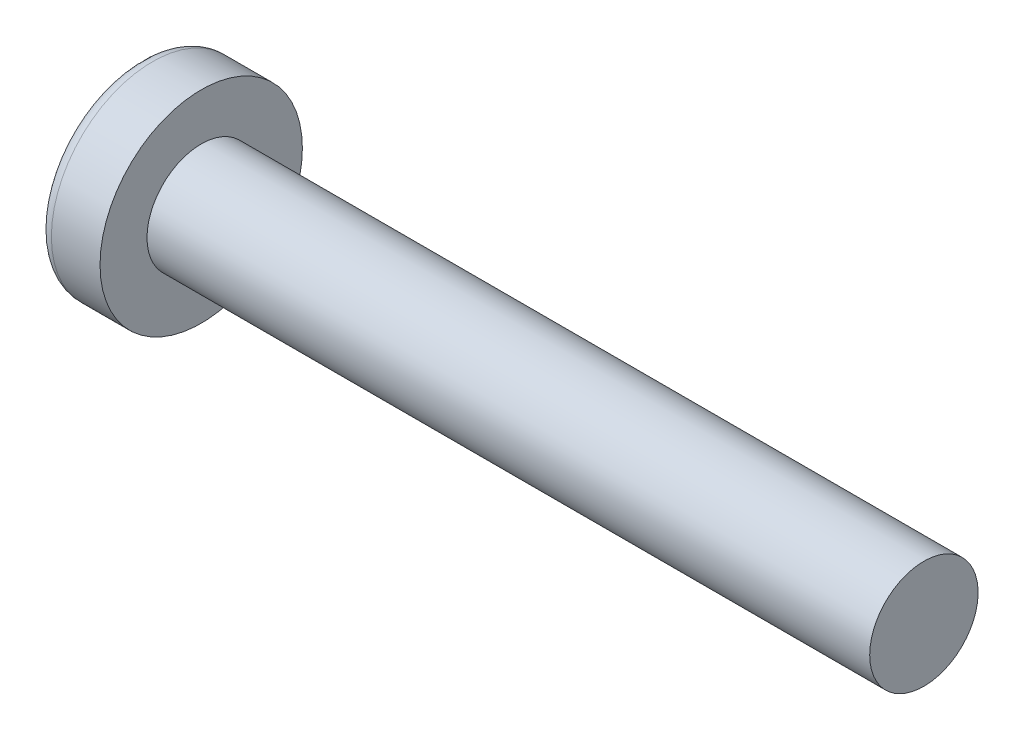
ISO-10303-21;
HEADER;
FILE_DESCRIPTION(('STEP AP214'),'2;1');
FILE_NAME('part.step','',(''),(''),'','','');
FILE_SCHEMA(('AUTOMOTIVE_DESIGN { 1 0 10303 214 1 1 1 1 }'));
ENDSEC;
DATA;
#1=APPLICATION_CONTEXT('core data for automotive mechanical design processes');
#2=APPLICATION_PROTOCOL_DEFINITION('international standard','automotive_design',2000,#1);
#3=PRODUCT_CONTEXT('',#1,'mechanical');
#4=PRODUCT('Part','Part','',(#3));
#5=PRODUCT_RELATED_PRODUCT_CATEGORY('part','',(#4));
#6=PRODUCT_DEFINITION_FORMATION('','',#4);
#7=PRODUCT_DEFINITION_CONTEXT('part definition',#1,'design');
#8=PRODUCT_DEFINITION('design','',#6,#7);
#9=PRODUCT_DEFINITION_SHAPE('','',#8);
#10=(LENGTH_UNIT() NAMED_UNIT(*) SI_UNIT(.MILLI.,.METRE.));
#11=(NAMED_UNIT(*) PLANE_ANGLE_UNIT() SI_UNIT($,.RADIAN.));
#12=(NAMED_UNIT(*) SI_UNIT($,.STERADIAN.) SOLID_ANGLE_UNIT());
#13=UNCERTAINTY_MEASURE_WITH_UNIT(LENGTH_MEASURE(1.E-05),#10,'distance_accuracy_value','');
#14=(GEOMETRIC_REPRESENTATION_CONTEXT(3) GLOBAL_UNCERTAINTY_ASSIGNED_CONTEXT((#13)) GLOBAL_UNIT_ASSIGNED_CONTEXT((#10,
#11,#12)) REPRESENTATION_CONTEXT('',''));
#15=CARTESIAN_POINT('',(0.,0.,0.));
#16=DIRECTION('',(0.,0.,1.));
#17=DIRECTION('',(1.,0.,0.));
#18=AXIS2_PLACEMENT_3D('',#15,#16,#17);
#19=CARTESIAN_POINT('',(2.01739130434783,0.,-0.15794466403162));
#20=DIRECTION('',(-0.104537710696287,0.,0.994520923380891));
#21=DIRECTION('',(0.994520923380891,0.,0.104537710696287));
#22=AXIS2_PLACEMENT_3D('',#19,#20,#21);
#23=PLANE('',#22);
#24=DIRECTION('',(-0.989130931836555,0.103971149085093,-0.103971149085093));
#25=VECTOR('',#24,1.);
#26=CARTESIAN_POINT('',(1.76,0.185000000000001,-0.184999999999999));
#27=LINE('',#26,#25);
#28=CARTESIAN_POINT('',(1.76,0.185,-0.184999999999999));
#29=VERTEX_POINT('',#28);
#30=CARTESIAN_POINT('',(0.0270341343313636,0.367158343834498,-0.367158343834493));
#31=VERTEX_POINT('',#30);
#32=EDGE_CURVE('E178',#29,#31,#27,.T.);
#33=ORIENTED_EDGE('',*,*,#32,.F.);
#34=DIRECTION('',(-0.80907355338853,0.581521616498006,-0.0850446632823175));
#35=VECTOR('',#34,1.);
#36=CARTESIAN_POINT('',(1.76,0.185,-0.185));
#37=LINE('',#36,#35);
#38=CARTESIAN_POINT('',(0.188596138461546,1.31444652548076,-0.350175974082167));
#39=VERTEX_POINT('',#38);
#40=EDGE_CURVE('E186',#29,#39,#37,.T.);
#41=ORIENTED_EDGE('',*,*,#40,.T.);
#42=CARTESIAN_POINT('',(0.188596138461547,1.31444652548076,-0.350175974082167));
#43=CARTESIAN_POINT('',(0.146535741725265,1.15917471210783,-0.354597095330013));
#44=CARTESIAN_POINT('',(0.112042043012942,1.00259812361751,-0.358222853433297));
#45=CARTESIAN_POINT('',(0.0581880416362142,0.686835396402088,-0.363883643350741));
#46=CARTESIAN_POINT('',(0.0388277389718098,0.527649257676991,-0.3659186751649));
#47=CARTESIAN_POINT('',(0.0270341343313647,0.367158343834508,-0.367158343834498));
#48=B_SPLINE_CURVE_WITH_KNOTS('',3,(#42,#43,#44,#45,#46,#47),.UNSPECIFIED.,.F.,.F.,(4,2,4),(0.,
0.481116103371659,0.962232206743319),.UNSPECIFIED.);
#49=EDGE_CURVE('E21',#39,#31,#48,.T.);
#50=ORIENTED_EDGE('',*,*,#49,.T.);
#51=EDGE_LOOP('',(#33,#41,#50));
#52=FACE_BOUND('',#51,.T.);
#53=ADVANCED_FACE('F17',(#52),#23,.T.);
#54=CARTESIAN_POINT('',(1.76,0.185,0.185));
#55=DIRECTION('',(0.583636048152575,0.812015371342714,0.));
#56=DIRECTION('',(-0.812015371342714,0.583636048152575,0.));
#57=AXIS2_PLACEMENT_3D('',#54,#55,#56);
#58=PLANE('',#57);
#59=DIRECTION('',(0.,0.,1.));
#60=VECTOR('',#59,1.);
#61=CARTESIAN_POINT('',(1.76,0.185,0.185));
#62=LINE('',#61,#60);
#63=CARTESIAN_POINT('',(1.76,0.185,0.185));
#64=VERTEX_POINT('',#63);
#65=EDGE_CURVE('E86',#64,#29,#62,.F.);
#66=ORIENTED_EDGE('',*,*,#65,.F.);
#67=DIRECTION('',(0.80907355338853,-0.581521616498006,-0.0850446632823172));
#68=VECTOR('',#67,1.);
#69=CARTESIAN_POINT('',(0.188596138461545,1.31444652548076,0.350175974082167));
#70=LINE('',#69,#68);
#71=CARTESIAN_POINT('',(0.188596138461546,1.31444652548076,0.350175974082167));
#72=VERTEX_POINT('',#71);
#73=EDGE_CURVE('E174',#72,#64,#70,.T.);
#74=ORIENTED_EDGE('',*,*,#73,.F.);
#75=CARTESIAN_POINT('',(0.188596138461547,1.31444652548076,-0.350175974082167));
#76=CARTESIAN_POINT('',(0.181505092768451,1.31954321457259,-0.233450649388112));
#77=CARTESIAN_POINT('',(0.177959569921918,1.32209155911854,-0.116725324694057));
#78=CARTESIAN_POINT('',(0.177959569921975,1.32209155911866,0.116725324694055));
#79=CARTESIAN_POINT('',(0.181505092768566,1.31954321457284,0.233450649388112));
#80=CARTESIAN_POINT('',(0.188596138461719,1.31444652548113,0.350175974082168));
#81=B_SPLINE_CURVE_WITH_KNOTS('',3,(#75,#76,#77,#78,#79,#80),.UNSPECIFIED.,.F.,.F.,(4,2,4),(0.,
0.35042088401523,0.70084176803046),.UNSPECIFIED.);
#82=EDGE_CURVE('E79',#39,#72,#81,.T.);
#83=ORIENTED_EDGE('',*,*,#82,.F.);
#84=ORIENTED_EDGE('',*,*,#40,.F.);
#85=EDGE_LOOP('',(#66,#74,#83,#84));
#86=FACE_BOUND('',#85,.T.);
#87=ADVANCED_FACE('F294',(#86),#58,.F.);
#88=CARTESIAN_POINT('',(2.01739130434783,0.15794466403162,0.));
#89=DIRECTION('',(-0.104537710696287,-0.994520923380891,0.));
#90=DIRECTION('',(0.994520923380891,-0.104537710696287,0.));
#91=AXIS2_PLACEMENT_3D('',#88,#89,#90);
#92=PLANE('',#91);
#93=DIRECTION('',(0.80907355338853,-0.0850446632823192,0.581521616498006));
#94=VECTOR('',#93,1.);
#95=CARTESIAN_POINT('',(0.188596138461544,0.350175974082172,-1.31444652548076));
#96=LINE('',#95,#94);
#97=CARTESIAN_POINT('',(0.188596138461545,0.350175974082172,-1.31444652548076));
#98=VERTEX_POINT('',#97);
#99=EDGE_CURVE('E165',#98,#29,#96,.T.);
#100=ORIENTED_EDGE('',*,*,#99,.T.);
#101=ORIENTED_EDGE('',*,*,#32,.T.);
#102=CARTESIAN_POINT('',(0.0270341343313624,0.367158343834489,-0.367158343834488));
#103=CARTESIAN_POINT('',(0.0388277389718077,0.365918675164897,-0.527649257676975));
#104=CARTESIAN_POINT('',(0.0581880416362123,0.363883643350741,-0.686835396402075));
#105=CARTESIAN_POINT('',(0.11204204301294,0.358222853433303,-1.0025981236175));
#106=CARTESIAN_POINT('',(0.146535741725263,0.354597095330019,-1.15917471210783));
#107=CARTESIAN_POINT('',(0.188596138461545,0.350175974082172,-1.31444652548076));
#108=B_SPLINE_CURVE_WITH_KNOTS('',3,(#102,#103,#104,#105,#106,#107),.UNSPECIFIED.,.F.,.F.,(4,2,
4),(0.,0.481116103371668,0.962232206743337),.UNSPECIFIED.);
#109=EDGE_CURVE('E183',#31,#98,#108,.T.);
#110=ORIENTED_EDGE('',*,*,#109,.T.);
#111=EDGE_LOOP('',(#100,#101,#110));
#112=FACE_BOUND('',#111,.T.);
#113=ADVANCED_FACE('F290',(#112),#92,.T.);
#114=CARTESIAN_POINT('',(2.01739130434783,0.,0.15794466403162));
#115=DIRECTION('',(-0.104537710696287,0.,-0.994520923380891));
#116=DIRECTION('',(-0.994520923380891,0.,0.104537710696287));
#117=AXIS2_PLACEMENT_3D('',#114,#115,#116);
#118=PLANE('',#117);
#119=DIRECTION('',(0.989130931836555,-0.103971149085092,-0.103971149085092));
#120=VECTOR('',#119,1.);
#121=CARTESIAN_POINT('',(0.0270341343313623,0.367158343834486,0.367158343834487));
#122=LINE('',#121,#120);
#123=CARTESIAN_POINT('',(0.0270341343313624,0.367158343834486,0.367158343834487));
#124=VERTEX_POINT('',#123);
#125=EDGE_CURVE('E159',#124,#64,#122,.T.);
#126=ORIENTED_EDGE('',*,*,#125,.F.);
#127=CARTESIAN_POINT('',(0.0270341343313624,0.367158343834486,0.367158343834487));
#128=CARTESIAN_POINT('',(0.0388277389718087,0.527649257676974,0.365918675164895));
#129=CARTESIAN_POINT('',(0.0581880416362138,0.686835396402074,0.363883643350739));
#130=CARTESIAN_POINT('',(0.112042043012942,1.0025981236175,0.358222853433299));
#131=CARTESIAN_POINT('',(0.146535741725265,1.15917471210783,0.354597095330016));
#132=CARTESIAN_POINT('',(0.188596138461547,1.31444652548076,0.350175974082169));
#133=B_SPLINE_CURVE_WITH_KNOTS('',3,(#127,#128,#129,#130,#131,#132),.UNSPECIFIED.,.F.,.F.,(4,2,
4),(0.,0.48111610337167,0.96223220674334),.UNSPECIFIED.);
#134=EDGE_CURVE('E177',#124,#72,#133,.T.);
#135=ORIENTED_EDGE('',*,*,#134,.T.);
#136=ORIENTED_EDGE('',*,*,#73,.T.);
#137=EDGE_LOOP('',(#126,#135,#136));
#138=FACE_BOUND('',#137,.T.);
#139=ADVANCED_FACE('F285',(#138),#118,.T.);
#140=CARTESIAN_POINT('',(1.76,0.185000000000001,-0.184999999999999));
#141=DIRECTION('',(0.583636048152575,0.,-0.812015371342714));
#142=DIRECTION('',(-0.812015371342714,0.,-0.583636048152575));
#143=AXIS2_PLACEMENT_3D('',#140,#141,#142);
#144=PLANE('',#143);
#145=DIRECTION('',(0.,1.,0.));
#146=VECTOR('',#145,1.);
#147=CARTESIAN_POINT('',(1.76,0.185000000000001,-0.184999999999999));
#148=LINE('',#147,#146);
#149=CARTESIAN_POINT('',(1.76,-0.185,-0.185));
#150=VERTEX_POINT('',#149);
#151=EDGE_CURVE('E110',#29,#150,#148,.F.);
#152=ORIENTED_EDGE('',*,*,#151,.F.);
#153=ORIENTED_EDGE('',*,*,#99,.F.);
#154=CARTESIAN_POINT('',(0.188596138461545,-0.350175974082162,-1.31444652548077));
#155=CARTESIAN_POINT('',(0.181505092768444,-0.233450649388107,-1.31954321457268));
#156=CARTESIAN_POINT('',(0.177959569921893,-0.116725324694051,-1.32209155911864));
#157=CARTESIAN_POINT('',(0.177959569921893,0.116725324694061,-1.32209155911864));
#158=CARTESIAN_POINT('',(0.181505092768444,0.233450649388116,-1.31954321457268));
#159=CARTESIAN_POINT('',(0.188596138461545,0.350175974082172,-1.31444652548076));
#160=B_SPLINE_CURVE_WITH_KNOTS('',3,(#154,#155,#156,#157,#158,#159),.UNSPECIFIED.,.F.,.F.,(4,2,
4),(0.,0.350420884015233,0.700841768030466),.UNSPECIFIED.);
#161=CARTESIAN_POINT('',(0.188596138461546,-0.350175974082162,-1.31444652548077));
#162=VERTEX_POINT('',#161);
#163=EDGE_CURVE('E168',#162,#98,#160,.T.);
#164=ORIENTED_EDGE('',*,*,#163,.F.);
#165=DIRECTION('',(-0.80907355338853,-0.0850446632823149,-0.581521616498007));
#166=VECTOR('',#165,1.);
#167=CARTESIAN_POINT('',(1.76,-0.184999999999999,-0.185));
#168=LINE('',#167,#166);
#169=EDGE_CURVE('E153',#150,#162,#168,.T.);
#170=ORIENTED_EDGE('',*,*,#169,.F.);
#171=EDGE_LOOP('',(#152,#153,#164,#170));
#172=FACE_BOUND('',#171,.T.);
#173=ADVANCED_FACE('F282',(#172),#144,.F.);
#174=CARTESIAN_POINT('',(2.01739130434783,0.15794466403162,0.));
#175=DIRECTION('',(-0.104537710696287,-0.994520923380891,0.));
#176=DIRECTION('',(0.994520923380891,-0.104537710696287,0.));
#177=AXIS2_PLACEMENT_3D('',#174,#175,#176);
#178=PLANE('',#177);
#179=ORIENTED_EDGE('',*,*,#125,.T.);
#180=DIRECTION('',(-0.80907355338853,0.0850446632823148,0.581521616498006));
#181=VECTOR('',#180,1.);
#182=CARTESIAN_POINT('',(1.76,0.185,0.185));
#183=LINE('',#182,#181);
#184=CARTESIAN_POINT('',(0.188596138461545,0.350175974082162,1.31444652548076));
#185=VERTEX_POINT('',#184);
#186=EDGE_CURVE('E103',#64,#185,#183,.T.);
#187=ORIENTED_EDGE('',*,*,#186,.T.);
#188=CARTESIAN_POINT('',(0.188596138461545,0.350175974082162,1.31444652548076));
#189=CARTESIAN_POINT('',(0.146535741725263,0.354597095330011,1.15917471210783));
#190=CARTESIAN_POINT('',(0.11204204301294,0.358222853433295,1.0025981236175));
#191=CARTESIAN_POINT('',(0.0581880416362123,0.363883643350737,0.686835396402075));
#192=CARTESIAN_POINT('',(0.0388277389718077,0.365918675164894,0.527649257676974));
#193=CARTESIAN_POINT('',(0.0270341343313625,0.367158343834487,0.367158343834487));
#194=B_SPLINE_CURVE_WITH_KNOTS('',3,(#188,#189,#190,#191,#192,#193),.UNSPECIFIED.,.F.,.F.,(4,2,
4),(0.,0.48111610337167,0.962232206743339),.UNSPECIFIED.);
#195=EDGE_CURVE('E162',#185,#124,#194,.T.);
#196=ORIENTED_EDGE('',*,*,#195,.T.);
#197=EDGE_LOOP('',(#179,#187,#196));
#198=FACE_BOUND('',#197,.T.);
#199=ADVANCED_FACE('F256',(#198),#178,.T.);
#200=CARTESIAN_POINT('',(2.01739130434783,-0.15794466403162,0.));
#201=DIRECTION('',(-0.104537710696287,0.994520923380891,0.));
#202=DIRECTION('',(-0.994520923380891,-0.104537710696287,0.));
#203=AXIS2_PLACEMENT_3D('',#200,#201,#202);
#204=PLANE('',#203);
#205=DIRECTION('',(-0.989130931836555,-0.103971149085092,-0.103971149085092));
#206=VECTOR('',#205,1.);
#207=CARTESIAN_POINT('',(1.76,-0.185,-0.185));
#208=LINE('',#207,#206);
#209=CARTESIAN_POINT('',(0.0270341343313625,-0.367158343834486,-0.367158343834489));
#210=VERTEX_POINT('',#209);
#211=EDGE_CURVE('E144',#150,#210,#208,.T.);
#212=ORIENTED_EDGE('',*,*,#211,.F.);
#213=ORIENTED_EDGE('',*,*,#169,.T.);
#214=CARTESIAN_POINT('',(0.188596138461547,-0.350175974082162,-1.31444652548077));
#215=CARTESIAN_POINT('',(0.146535741725264,-0.354597095330011,-1.15917471210783));
#216=CARTESIAN_POINT('',(0.112042043012941,-0.358222853433295,-1.0025981236175));
#217=CARTESIAN_POINT('',(0.0581880416362128,-0.363883643350736,-0.686835396402077));
#218=CARTESIAN_POINT('',(0.038827738971808,-0.365918675164893,-0.527649257676976));
#219=CARTESIAN_POINT('',(0.0270341343313624,-0.367158343834485,-0.367158343834488));
#220=B_SPLINE_CURVE_WITH_KNOTS('',3,(#214,#215,#216,#217,#218,#219),.UNSPECIFIED.,.F.,.F.,(4,2,
4),(0.,0.481116103371671,0.962232206743341),.UNSPECIFIED.);
#221=EDGE_CURVE('E156',#162,#210,#220,.T.);
#222=ORIENTED_EDGE('',*,*,#221,.T.);
#223=EDGE_LOOP('',(#212,#213,#222));
#224=FACE_BOUND('',#223,.T.);
#225=ADVANCED_FACE('F252',(#224),#204,.T.);
#226=CARTESIAN_POINT('',(1.76,-0.185000000000001,0.184999999999999));
#227=DIRECTION('',(0.583636048152575,0.,0.812015371342714));
#228=DIRECTION('',(0.812015371342714,0.,-0.583636048152575));
#229=AXIS2_PLACEMENT_3D('',#226,#227,#228);
#230=PLANE('',#229);
#231=DIRECTION('',(0.,1.,0.));
#232=VECTOR('',#231,1.);
#233=CARTESIAN_POINT('',(1.76,0.185,0.184999999999999));
#234=LINE('',#233,#232);
#235=CARTESIAN_POINT('',(1.76,-0.185,0.185));
#236=VERTEX_POINT('',#235);
#237=EDGE_CURVE('E95',#236,#64,#234,.T.);
#238=ORIENTED_EDGE('',*,*,#237,.F.);
#239=DIRECTION('',(0.80907355338853,0.0850446632823192,-0.581521616498005));
#240=VECTOR('',#239,1.);
#241=CARTESIAN_POINT('',(0.188596138461545,-0.350175974082172,1.31444652548076));
#242=LINE('',#241,#240);
#243=CARTESIAN_POINT('',(0.188596138461545,-0.350175974082171,1.31444652548076));
#244=VERTEX_POINT('',#243);
#245=EDGE_CURVE('E100',#244,#236,#242,.T.);
#246=ORIENTED_EDGE('',*,*,#245,.F.);
#247=CARTESIAN_POINT('',(0.188596138461545,0.350175974082162,1.31444652548077));
#248=CARTESIAN_POINT('',(0.181505092768444,0.233450649388107,1.31954321457268));
#249=CARTESIAN_POINT('',(0.177959569921893,0.116725324694051,1.32209155911864));
#250=CARTESIAN_POINT('',(0.177959569921893,-0.11672532469406,1.32209155911864));
#251=CARTESIAN_POINT('',(0.181505092768444,-0.233450649388116,1.31954321457268));
#252=CARTESIAN_POINT('',(0.188596138461545,-0.350175974082171,1.31444652548076));
#253=B_SPLINE_CURVE_WITH_KNOTS('',3,(#247,#248,#249,#250,#251,#252),.UNSPECIFIED.,.F.,.F.,(4,2,
4),(0.,0.350420884015233,0.700841768030465),.UNSPECIFIED.);
#254=EDGE_CURVE('E150',#185,#244,#253,.T.);
#255=ORIENTED_EDGE('',*,*,#254,.F.);
#256=ORIENTED_EDGE('',*,*,#186,.F.);
#257=EDGE_LOOP('',(#238,#246,#255,#256));
#258=FACE_BOUND('',#257,.T.);
#259=ADVANCED_FACE('F97',(#258),#230,.F.);
#260=CARTESIAN_POINT('',(2.01739130434783,0.,-0.15794466403162));
#261=DIRECTION('',(-0.104537710696287,0.,0.994520923380891));
#262=DIRECTION('',(0.994520923380891,0.,0.104537710696287));
#263=AXIS2_PLACEMENT_3D('',#260,#261,#262);
#264=PLANE('',#263);
#265=ORIENTED_EDGE('',*,*,#211,.T.);
#266=CARTESIAN_POINT('',(0.0270341343313625,-0.367158343834487,-0.367158343834489));
#267=CARTESIAN_POINT('',(0.0388277389718088,-0.527649257676974,-0.365918675164896));
#268=CARTESIAN_POINT('',(0.0581880416362139,-0.686835396402074,-0.363883643350739));
#269=CARTESIAN_POINT('',(0.112042043012942,-1.0025981236175,-0.358222853433299));
#270=CARTESIAN_POINT('',(0.146535741725265,-1.15917471210783,-0.354597095330015));
#271=CARTESIAN_POINT('',(0.188596138461547,-1.31444652548076,-0.350175974082167));
#272=B_SPLINE_CURVE_WITH_KNOTS('',3,(#266,#267,#268,#269,#270,#271),.UNSPECIFIED.,.F.,.F.,(4,2,
4),(0.,0.48111610337167,0.96223220674334),.UNSPECIFIED.);
#273=CARTESIAN_POINT('',(0.188596138461547,-1.31444652548076,-0.350175974082167));
#274=VERTEX_POINT('',#273);
#275=EDGE_CURVE('E105',#210,#274,#272,.T.);
#276=ORIENTED_EDGE('',*,*,#275,.T.);
#277=DIRECTION('',(0.80907355338853,0.581521616498006,0.0850446632823172));
#278=VECTOR('',#277,1.);
#279=CARTESIAN_POINT('',(0.188596138461544,-1.31444652548076,-0.350175974082167));
#280=LINE('',#279,#278);
#281=EDGE_CURVE('E113',#274,#150,#280,.T.);
#282=ORIENTED_EDGE('',*,*,#281,.T.);
#283=EDGE_LOOP('',(#265,#276,#282));
#284=FACE_BOUND('',#283,.T.);
#285=ADVANCED_FACE('F245',(#284),#264,.T.);
#286=CARTESIAN_POINT('',(1.76,0.185,-0.185));
#287=DIRECTION('',(-1.,0.,0.));
#288=DIRECTION('',(0.,0.,1.));
#289=AXIS2_PLACEMENT_3D('',#286,#287,#288);
#290=PLANE('',#289);
#291=ORIENTED_EDGE('',*,*,#237,.T.);
#292=ORIENTED_EDGE('',*,*,#65,.T.);
#293=ORIENTED_EDGE('',*,*,#151,.T.);
#294=DIRECTION('',(0.,0.,1.));
#295=VECTOR('',#294,1.);
#296=CARTESIAN_POINT('',(1.76,-0.185,-0.185));
#297=LINE('',#296,#295);
#298=EDGE_CURVE('E108',#150,#236,#297,.T.);
#299=ORIENTED_EDGE('',*,*,#298,.T.);
#300=EDGE_LOOP('',(#291,#292,#293,#299));
#301=FACE_BOUND('',#300,.T.);
#302=ADVANCED_FACE('F109',(#301),#290,.T.);
#303=CARTESIAN_POINT('',(2.01739130434783,-0.15794466403162,0.));
#304=DIRECTION('',(-0.104537710696287,0.994520923380891,0.));
#305=DIRECTION('',(-0.994520923380891,-0.104537710696287,0.));
#306=AXIS2_PLACEMENT_3D('',#303,#304,#305);
#307=PLANE('',#306);
#308=ORIENTED_EDGE('',*,*,#245,.T.);
#309=DIRECTION('',(0.989130931836555,0.103971149085093,-0.103971149085092));
#310=VECTOR('',#309,1.);
#311=CARTESIAN_POINT('',(0.0270341343313611,-0.367158343834489,0.367158343834487));
#312=LINE('',#311,#310);
#313=CARTESIAN_POINT('',(0.0270341343313618,-0.367158343834489,0.367158343834487));
#314=VERTEX_POINT('',#313);
#315=EDGE_CURVE('E112',#314,#236,#312,.T.);
#316=ORIENTED_EDGE('',*,*,#315,.F.);
#317=CARTESIAN_POINT('',(0.0270341343313624,-0.367158343834489,0.367158343834487));
#318=CARTESIAN_POINT('',(0.0388277389718078,-0.365918675164897,0.527649257676974));
#319=CARTESIAN_POINT('',(0.0581880416362125,-0.363883643350742,0.686835396402074));
#320=CARTESIAN_POINT('',(0.11204204301294,-0.358222853433302,1.0025981236175));
#321=CARTESIAN_POINT('',(0.146535741725263,-0.354597095330018,1.15917471210782));
#322=CARTESIAN_POINT('',(0.188596138461545,-0.350175974082171,1.31444652548076));
#323=B_SPLINE_CURVE_WITH_KNOTS('',3,(#317,#318,#319,#320,#321,#322),.UNSPECIFIED.,.F.,.F.,(4,2,
4),(0.,0.481116103371669,0.962232206743337),.UNSPECIFIED.);
#324=EDGE_CURVE('E104',#314,#244,#323,.T.);
#325=ORIENTED_EDGE('',*,*,#324,.T.);
#326=EDGE_LOOP('',(#308,#316,#325));
#327=FACE_BOUND('',#326,.T.);
#328=ADVANCED_FACE('F117',(#327),#307,.T.);
#329=CARTESIAN_POINT('',(1.76,-0.185,-0.185));
#330=DIRECTION('',(0.583636048152575,-0.812015371342714,0.));
#331=DIRECTION('',(0.812015371342714,0.583636048152575,0.));
#332=AXIS2_PLACEMENT_3D('',#329,#330,#331);
#333=PLANE('',#332);
#334=ORIENTED_EDGE('',*,*,#298,.F.);
#335=ORIENTED_EDGE('',*,*,#281,.F.);
#336=CARTESIAN_POINT('',(0.188596138461547,-1.31444652548076,0.350175974082166));
#337=CARTESIAN_POINT('',(0.181505092768451,-1.31954321457259,0.233450649388111));
#338=CARTESIAN_POINT('',(0.177959569921918,-1.32209155911854,0.116725324694055));
#339=CARTESIAN_POINT('',(0.177959569921975,-1.32209155911866,-0.116725324694056));
#340=CARTESIAN_POINT('',(0.181505092768566,-1.31954321457284,-0.233450649388113));
#341=CARTESIAN_POINT('',(0.188596138461719,-1.31444652548113,-0.35017597408217));
#342=B_SPLINE_CURVE_WITH_KNOTS('',3,(#336,#337,#338,#339,#340,#341),.UNSPECIFIED.,.F.,.F.,(4,2,
4),(0.,0.35042088401523,0.70084176803046),.UNSPECIFIED.);
#343=CARTESIAN_POINT('',(0.188596138461546,-1.31444652548076,0.350175974082166));
#344=VERTEX_POINT('',#343);
#345=EDGE_CURVE('E41',#344,#274,#342,.T.);
#346=ORIENTED_EDGE('',*,*,#345,.F.);
#347=DIRECTION('',(-0.80907355338853,-0.581521616498006,0.085044663282317));
#348=VECTOR('',#347,1.);
#349=CARTESIAN_POINT('',(1.76,-0.185000000000001,0.185));
#350=LINE('',#349,#348);
#351=EDGE_CURVE('E121',#236,#344,#350,.T.);
#352=ORIENTED_EDGE('',*,*,#351,.F.);
#353=EDGE_LOOP('',(#334,#335,#346,#352));
#354=FACE_BOUND('',#353,.T.);
#355=ADVANCED_FACE('F122',(#354),#333,.F.);
#356=CARTESIAN_POINT('',(2.01739130434783,0.,0.15794466403162));
#357=DIRECTION('',(-0.104537710696287,0.,-0.994520923380891));
#358=DIRECTION('',(-0.994520923380891,0.,0.104537710696287));
#359=AXIS2_PLACEMENT_3D('',#356,#357,#358);
#360=PLANE('',#359);
#361=ORIENTED_EDGE('',*,*,#315,.T.);
#362=ORIENTED_EDGE('',*,*,#351,.T.);
#363=CARTESIAN_POINT('',(0.0270341343313624,-0.367158343834489,0.367158343834487));
#364=CARTESIAN_POINT('',(0.0388277389718087,-0.527649257676976,0.365918675164895));
#365=CARTESIAN_POINT('',(0.0581880416362139,-0.686835396402076,0.363883643350739));
#366=CARTESIAN_POINT('',(0.112042043012942,-1.0025981236175,0.358222853433298));
#367=CARTESIAN_POINT('',(0.146535741725265,-1.15917471210783,0.354597095330014));
#368=CARTESIAN_POINT('',(0.188596138461547,-1.31444652548076,0.350175974082166));
#369=B_SPLINE_CURVE_WITH_KNOTS('',3,(#363,#364,#365,#366,#367,#368),.UNSPECIFIED.,.F.,.F.,(4,2,
4),(0.,0.481116103371669,0.962232206743339),.UNSPECIFIED.);
#370=EDGE_CURVE('E125',#314,#344,#369,.T.);
#371=ORIENTED_EDGE('',*,*,#370,.F.);
#372=EDGE_LOOP('',(#361,#362,#371));
#373=FACE_BOUND('',#372,.T.);
#374=ADVANCED_FACE('F127',(#373),#360,.T.);
#375=CARTESIAN_POINT('',(5.,0.,0.));
#376=DIRECTION('',(0.,1.,0.));
#377=DIRECTION('',(1.,0.,0.));
#378=AXIS2_PLACEMENT_3D('',#375,#376,#377);
#379=SPHERICAL_SURFACE('',#378,5.);
#380=CARTESIAN_POINT('',(0.747150706810474,0.,0.));
#381=DIRECTION('',(-1.,0.,0.));
#382=DIRECTION('',(0.,0.,1.));
#383=AXIS2_PLACEMENT_3D('',#380,#381,#382);
#384=CIRCLE('',#383,2.62931034482758);
#385=CARTESIAN_POINT('',(0.747150706810474,0.,2.62931034482758));
#386=VERTEX_POINT('',#385);
#387=EDGE_CURVE('E200',#386,#386,#384,.F.);
#388=ORIENTED_EDGE('',*,*,#387,.F.);
#389=EDGE_LOOP('',(#388));
#390=FACE_BOUND('',#389,.T.);
#391=ORIENTED_EDGE('',*,*,#370,.T.);
#392=ORIENTED_EDGE('',*,*,#345,.T.);
#393=ORIENTED_EDGE('',*,*,#275,.F.);
#394=ORIENTED_EDGE('',*,*,#221,.F.);
#395=ORIENTED_EDGE('',*,*,#163,.T.);
#396=ORIENTED_EDGE('',*,*,#109,.F.);
#397=ORIENTED_EDGE('',*,*,#49,.F.);
#398=ORIENTED_EDGE('',*,*,#82,.T.);
#399=ORIENTED_EDGE('',*,*,#134,.F.);
#400=ORIENTED_EDGE('',*,*,#195,.F.);
#401=ORIENTED_EDGE('',*,*,#254,.T.);
#402=ORIENTED_EDGE('',*,*,#324,.F.);
#403=EDGE_LOOP('',(#391,#392,#393,#394,#395,#396,#397,#398,#399,#400,#401,#402));
#404=FACE_BOUND('',#403,.T.);
#405=ADVANCED_FACE('F215',(#390,#404),#379,.T.);
#406=CARTESIAN_POINT('',(1.05335585592012,0.,0.));
#407=DIRECTION('',(-1.,0.,0.));
#408=DIRECTION('',(0.,0.,1.));
#409=AXIS2_PLACEMENT_3D('',#406,#407,#408);
#410=TOROIDAL_SURFACE('',#409,2.44,0.360000000000001);
#411=ORIENTED_EDGE('',*,*,#387,.T.);
#412=EDGE_LOOP('',(#411));
#413=FACE_BOUND('',#412,.T.);
#414=CARTESIAN_POINT('',(1.05335585592012,0.,0.));
#415=DIRECTION('',(-1.,0.,0.));
#416=DIRECTION('',(0.,0.,1.));
#417=AXIS2_PLACEMENT_3D('',#414,#415,#416);
#418=CIRCLE('',#417,2.8);
#419=CARTESIAN_POINT('',(1.05335585592012,0.,2.8));
#420=VERTEX_POINT('',#419);
#421=EDGE_CURVE('E199',#420,#420,#418,.F.);
#422=ORIENTED_EDGE('',*,*,#421,.F.);
#423=EDGE_LOOP('',(#422));
#424=FACE_BOUND('',#423,.T.);
#425=ADVANCED_FACE('F340',(#413,#424),#410,.T.);
#426=CARTESIAN_POINT('',(-25.4,0.,0.));
#427=DIRECTION('',(-1.,0.,0.));
#428=DIRECTION('',(0.,0.,1.));
#429=AXIS2_PLACEMENT_3D('',#426,#427,#428);
#430=CYLINDRICAL_SURFACE('',#429,2.8);
#431=ORIENTED_EDGE('',*,*,#421,.T.);
#432=EDGE_LOOP('',(#431));
#433=FACE_BOUND('',#432,.T.);
#434=CARTESIAN_POINT('',(2.4,0.,0.));
#435=DIRECTION('',(-1.,0.,0.));
#436=DIRECTION('',(0.,0.,1.));
#437=AXIS2_PLACEMENT_3D('',#434,#435,#436);
#438=CIRCLE('',#437,2.8);
#439=CARTESIAN_POINT('',(2.4,0.,2.8));
#440=VERTEX_POINT('',#439);
#441=EDGE_CURVE('E196',#440,#440,#438,.T.);
#442=ORIENTED_EDGE('',*,*,#441,.T.);
#443=EDGE_LOOP('',(#442));
#444=FACE_BOUND('',#443,.T.);
#445=ADVANCED_FACE('F337',(#433,#444),#430,.T.);
#446=CARTESIAN_POINT('',(22.4,1.5,0.));
#447=DIRECTION('',(1.,0.,0.));
#448=DIRECTION('',(0.,0.,-1.));
#449=AXIS2_PLACEMENT_3D('',#446,#447,#448);
#450=PLANE('',#449);
#451=CARTESIAN_POINT('',(22.4,0.,0.));
#452=DIRECTION('',(-1.,0.,0.));
#453=DIRECTION('',(0.,0.,1.));
#454=AXIS2_PLACEMENT_3D('',#451,#452,#453);
#455=CIRCLE('',#454,1.5);
#456=CARTESIAN_POINT('',(22.4,0.,1.5));
#457=VERTEX_POINT('',#456);
#458=EDGE_CURVE('E32',#457,#457,#455,.T.);
#459=ORIENTED_EDGE('',*,*,#458,.F.);
#460=EDGE_LOOP('',(#459));
#461=FACE_BOUND('',#460,.T.);
#462=ADVANCED_FACE('F330',(#461),#450,.T.);
#463=CARTESIAN_POINT('',(2.4,1.5,0.));
#464=DIRECTION('',(-1.,0.,0.));
#465=DIRECTION('',(0.,0.,1.));
#466=AXIS2_PLACEMENT_3D('',#463,#464,#465);
#467=PLANE('',#466);
#468=CARTESIAN_POINT('',(2.4,0.,0.));
#469=DIRECTION('',(-1.,0.,0.));
#470=DIRECTION('',(0.,0.,1.));
#471=AXIS2_PLACEMENT_3D('',#468,#469,#470);
#472=CIRCLE('',#471,1.5);
#473=CARTESIAN_POINT('',(2.4,0.,1.5));
#474=VERTEX_POINT('',#473);
#475=EDGE_CURVE('E11',#474,#474,#472,.F.);
#476=ORIENTED_EDGE('',*,*,#475,.F.);
#477=EDGE_LOOP('',(#476));
#478=FACE_BOUND('',#477,.T.);
#479=ORIENTED_EDGE('',*,*,#441,.F.);
#480=EDGE_LOOP('',(#479));
#481=FACE_BOUND('',#480,.T.);
#482=ADVANCED_FACE('F324',(#478,#481),#467,.F.);
#483=CARTESIAN_POINT('',(-25.4,0.,0.));
#484=DIRECTION('',(-1.,0.,0.));
#485=DIRECTION('',(0.,0.,1.));
#486=AXIS2_PLACEMENT_3D('',#483,#484,#485);
#487=CYLINDRICAL_SURFACE('',#486,1.5);
#488=ORIENTED_EDGE('',*,*,#475,.T.);
#489=EDGE_LOOP('',(#488));
#490=FACE_BOUND('',#489,.T.);
#491=ORIENTED_EDGE('',*,*,#458,.T.);
#492=EDGE_LOOP('',(#491));
#493=FACE_BOUND('',#492,.T.);
#494=ADVANCED_FACE('F322',(#490,#493),#487,.T.);
#495=CLOSED_SHELL('',(#53,#87,#113,#139,#173,#199,#225,#259,#285,#302,#328,#355,#374,#405,#425,
#445,#462,#482,#494));
#496=MANIFOLD_SOLID_BREP('B1',#495);
#497=ADVANCED_BREP_SHAPE_REPRESENTATION('',(#18,#496),#14);
#498=SHAPE_DEFINITION_REPRESENTATION(#9,#497);
ENDSEC;
END-ISO-10303-21;
